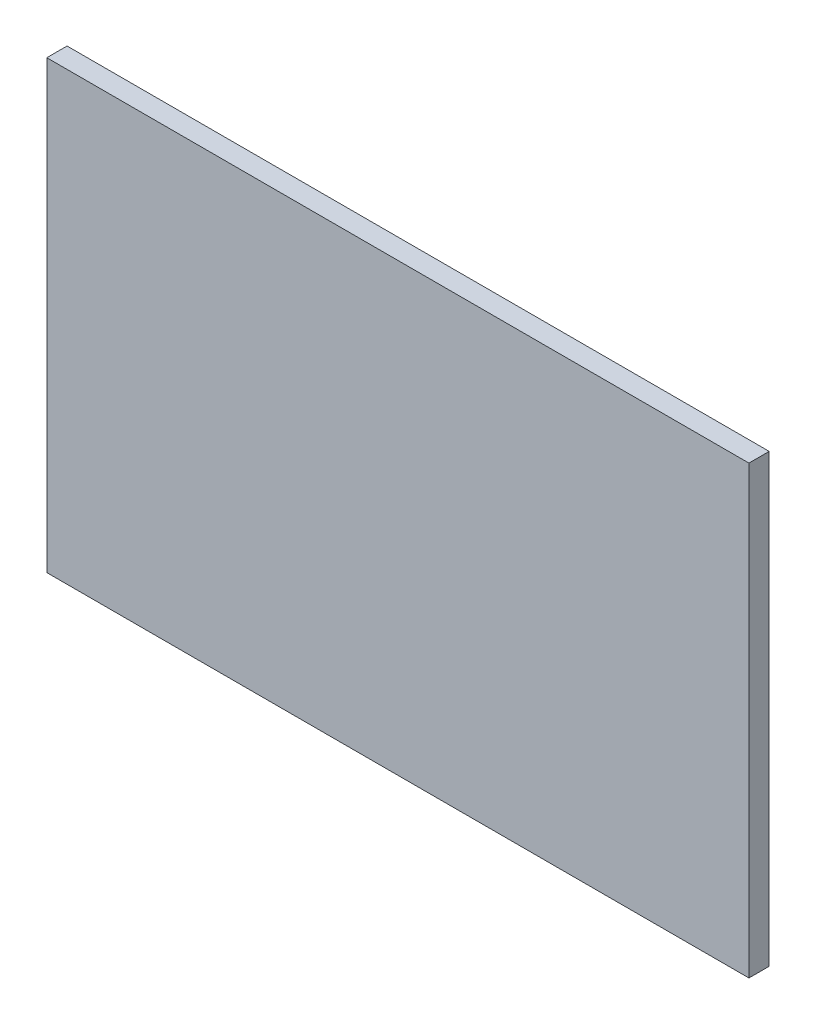
ISO-10303-21;
HEADER;
FILE_DESCRIPTION(('STEP AP214'),'2;1');
FILE_NAME('part.step','',(''),(''),'','','');
FILE_SCHEMA(('AUTOMOTIVE_DESIGN { 1 0 10303 214 1 1 1 1 }'));
ENDSEC;
DATA;
#1=APPLICATION_CONTEXT('core data for automotive mechanical design processes');
#2=APPLICATION_PROTOCOL_DEFINITION('international standard','automotive_design',2000,#1);
#3=PRODUCT_CONTEXT('',#1,'mechanical');
#4=PRODUCT('Part','Part','',(#3));
#5=PRODUCT_RELATED_PRODUCT_CATEGORY('part','',(#4));
#6=PRODUCT_DEFINITION_FORMATION('','',#4);
#7=PRODUCT_DEFINITION_CONTEXT('part definition',#1,'design');
#8=PRODUCT_DEFINITION('design','',#6,#7);
#9=PRODUCT_DEFINITION_SHAPE('','',#8);
#10=(LENGTH_UNIT() NAMED_UNIT(*) SI_UNIT(.MILLI.,.METRE.));
#11=(NAMED_UNIT(*) PLANE_ANGLE_UNIT() SI_UNIT($,.RADIAN.));
#12=(NAMED_UNIT(*) SI_UNIT($,.STERADIAN.) SOLID_ANGLE_UNIT());
#13=UNCERTAINTY_MEASURE_WITH_UNIT(LENGTH_MEASURE(1.E-05),#10,'distance_accuracy_value','');
#14=(GEOMETRIC_REPRESENTATION_CONTEXT(3) GLOBAL_UNCERTAINTY_ASSIGNED_CONTEXT((#13)) GLOBAL_UNIT_ASSIGNED_CONTEXT((#10,
#11,#12)) REPRESENTATION_CONTEXT('',''));
#15=CARTESIAN_POINT('',(0.,0.,0.));
#16=DIRECTION('',(0.,0.,1.));
#17=DIRECTION('',(1.,0.,0.));
#18=AXIS2_PLACEMENT_3D('',#15,#16,#17);
#19=CARTESIAN_POINT('',(109.982,-69.85,6.35));
#20=DIRECTION('',(-1.,0.,0.));
#21=DIRECTION('',(0.,0.,1.));
#22=AXIS2_PLACEMENT_3D('',#19,#20,#21);
#23=PLANE('',#22);
#24=DIRECTION('',(0.,1.,0.));
#25=VECTOR('',#24,1.);
#26=CARTESIAN_POINT('',(109.982,-69.85,0.));
#27=LINE('',#26,#25);
#28=CARTESIAN_POINT('',(109.982,-69.85,0.));
#29=VERTEX_POINT('',#28);
#30=CARTESIAN_POINT('',(109.982,69.85,0.));
#31=VERTEX_POINT('',#30);
#32=EDGE_CURVE('E113',#29,#31,#27,.T.);
#33=ORIENTED_EDGE('',*,*,#32,.T.);
#34=DIRECTION('',(0.,0.,-1.));
#35=VECTOR('',#34,1.);
#36=CARTESIAN_POINT('',(109.982,69.85,6.35));
#37=LINE('',#36,#35);
#38=CARTESIAN_POINT('',(109.982,69.85,6.35));
#39=VERTEX_POINT('',#38);
#40=EDGE_CURVE('E11',#39,#31,#37,.T.);
#41=ORIENTED_EDGE('',*,*,#40,.F.);
#42=DIRECTION('',(0.,1.,0.));
#43=VECTOR('',#42,1.);
#44=CARTESIAN_POINT('',(109.982,-69.85,6.35));
#45=LINE('',#44,#43);
#46=CARTESIAN_POINT('',(109.982,-69.85,6.35));
#47=VERTEX_POINT('',#46);
#48=EDGE_CURVE('E97',#47,#39,#45,.T.);
#49=ORIENTED_EDGE('',*,*,#48,.F.);
#50=DIRECTION('',(0.,0.,-1.));
#51=VECTOR('',#50,1.);
#52=CARTESIAN_POINT('',(109.982,-69.85,6.35));
#53=LINE('',#52,#51);
#54=EDGE_CURVE('E109',#47,#29,#53,.T.);
#55=ORIENTED_EDGE('',*,*,#54,.T.);
#56=EDGE_LOOP('',(#33,#41,#49,#55));
#57=FACE_BOUND('',#56,.T.);
#58=ADVANCED_FACE('F45',(#57),#23,.F.);
#59=CARTESIAN_POINT('',(-109.982,69.85,6.35));
#60=DIRECTION('',(0.,-1.,0.));
#61=DIRECTION('',(0.,0.,-1.));
#62=AXIS2_PLACEMENT_3D('',#59,#60,#61);
#63=PLANE('',#62);
#64=DIRECTION('',(-1.,0.,0.));
#65=VECTOR('',#64,1.);
#66=CARTESIAN_POINT('',(-109.982,69.85,0.));
#67=LINE('',#66,#65);
#68=CARTESIAN_POINT('',(-109.982,69.85,0.));
#69=VERTEX_POINT('',#68);
#70=EDGE_CURVE('E102',#31,#69,#67,.T.);
#71=ORIENTED_EDGE('',*,*,#70,.T.);
#72=DIRECTION('',(0.,0.,-1.));
#73=VECTOR('',#72,1.);
#74=CARTESIAN_POINT('',(-109.982,69.85,6.35));
#75=LINE('',#74,#73);
#76=CARTESIAN_POINT('',(-109.982,69.85,6.35));
#77=VERTEX_POINT('',#76);
#78=EDGE_CURVE('E54',#77,#69,#75,.T.);
#79=ORIENTED_EDGE('',*,*,#78,.F.);
#80=DIRECTION('',(-1.,0.,0.));
#81=VECTOR('',#80,1.);
#82=CARTESIAN_POINT('',(-109.982,69.85,6.35));
#83=LINE('',#82,#81);
#84=EDGE_CURVE('E92',#39,#77,#83,.T.);
#85=ORIENTED_EDGE('',*,*,#84,.F.);
#86=ORIENTED_EDGE('',*,*,#40,.T.);
#87=EDGE_LOOP('',(#71,#79,#85,#86));
#88=FACE_BOUND('',#87,.T.);
#89=ADVANCED_FACE('F101',(#88),#63,.F.);
#90=CARTESIAN_POINT('',(-109.982,-69.85,6.35));
#91=DIRECTION('',(1.,0.,0.));
#92=DIRECTION('',(0.,0.,-1.));
#93=AXIS2_PLACEMENT_3D('',#90,#91,#92);
#94=PLANE('',#93);
#95=DIRECTION('',(0.,-1.,0.));
#96=VECTOR('',#95,1.);
#97=CARTESIAN_POINT('',(-109.982,-69.85,0.));
#98=LINE('',#97,#96);
#99=CARTESIAN_POINT('',(-109.982,-69.85,0.));
#100=VERTEX_POINT('',#99);
#101=EDGE_CURVE('E79',#69,#100,#98,.T.);
#102=ORIENTED_EDGE('',*,*,#101,.T.);
#103=DIRECTION('',(0.,0.,-1.));
#104=VECTOR('',#103,1.);
#105=CARTESIAN_POINT('',(-109.982,-69.85,6.35));
#106=LINE('',#105,#104);
#107=CARTESIAN_POINT('',(-109.982,-69.85,6.35));
#108=VERTEX_POINT('',#107);
#109=EDGE_CURVE('E104',#108,#100,#106,.T.);
#110=ORIENTED_EDGE('',*,*,#109,.F.);
#111=DIRECTION('',(0.,-1.,0.));
#112=VECTOR('',#111,1.);
#113=CARTESIAN_POINT('',(-109.982,-69.85,6.35));
#114=LINE('',#113,#112);
#115=EDGE_CURVE('E95',#77,#108,#114,.T.);
#116=ORIENTED_EDGE('',*,*,#115,.F.);
#117=ORIENTED_EDGE('',*,*,#78,.T.);
#118=EDGE_LOOP('',(#102,#110,#116,#117));
#119=FACE_BOUND('',#118,.T.);
#120=ADVANCED_FACE('F105',(#119),#94,.F.);
#121=CARTESIAN_POINT('',(-109.982,-69.85,6.35));
#122=DIRECTION('',(0.,1.,0.));
#123=DIRECTION('',(0.,0.,1.));
#124=AXIS2_PLACEMENT_3D('',#121,#122,#123);
#125=PLANE('',#124);
#126=DIRECTION('',(1.,0.,0.));
#127=VECTOR('',#126,1.);
#128=CARTESIAN_POINT('',(-109.982,-69.85,0.));
#129=LINE('',#128,#127);
#130=EDGE_CURVE('E85',#100,#29,#129,.T.);
#131=ORIENTED_EDGE('',*,*,#130,.T.);
#132=ORIENTED_EDGE('',*,*,#54,.F.);
#133=DIRECTION('',(1.,0.,0.));
#134=VECTOR('',#133,1.);
#135=CARTESIAN_POINT('',(-109.982,-69.85,6.35));
#136=LINE('',#135,#134);
#137=EDGE_CURVE('E62',#108,#47,#136,.T.);
#138=ORIENTED_EDGE('',*,*,#137,.F.);
#139=ORIENTED_EDGE('',*,*,#109,.T.);
#140=EDGE_LOOP('',(#131,#132,#138,#139));
#141=FACE_BOUND('',#140,.T.);
#142=ADVANCED_FACE('F126',(#141),#125,.F.);
#143=CARTESIAN_POINT('',(0.,0.,6.35));
#144=DIRECTION('',(0.,0.,-1.));
#145=DIRECTION('',(-1.,0.,0.));
#146=AXIS2_PLACEMENT_3D('',#143,#144,#145);
#147=PLANE('',#146);
#148=ORIENTED_EDGE('',*,*,#48,.T.);
#149=ORIENTED_EDGE('',*,*,#84,.T.);
#150=ORIENTED_EDGE('',*,*,#115,.T.);
#151=ORIENTED_EDGE('',*,*,#137,.T.);
#152=EDGE_LOOP('',(#148,#149,#150,#151));
#153=FACE_BOUND('',#152,.T.);
#154=ADVANCED_FACE('F93',(#153),#147,.F.);
#155=CARTESIAN_POINT('',(0.,0.,0.));
#156=DIRECTION('',(0.,0.,-1.));
#157=DIRECTION('',(-1.,0.,0.));
#158=AXIS2_PLACEMENT_3D('',#155,#156,#157);
#159=PLANE('',#158);
#160=ORIENTED_EDGE('',*,*,#32,.F.);
#161=ORIENTED_EDGE('',*,*,#130,.F.);
#162=ORIENTED_EDGE('',*,*,#101,.F.);
#163=ORIENTED_EDGE('',*,*,#70,.F.);
#164=EDGE_LOOP('',(#160,#161,#162,#163));
#165=FACE_BOUND('',#164,.T.);
#166=ADVANCED_FACE('F129',(#165),#159,.T.);
#167=CLOSED_SHELL('',(#58,#89,#120,#142,#154,#166));
#168=MANIFOLD_SOLID_BREP('B2',#167);
#169=ADVANCED_BREP_SHAPE_REPRESENTATION('',(#18,#168),#14);
#170=SHAPE_DEFINITION_REPRESENTATION(#9,#169);
ENDSEC;
END-ISO-10303-21;
